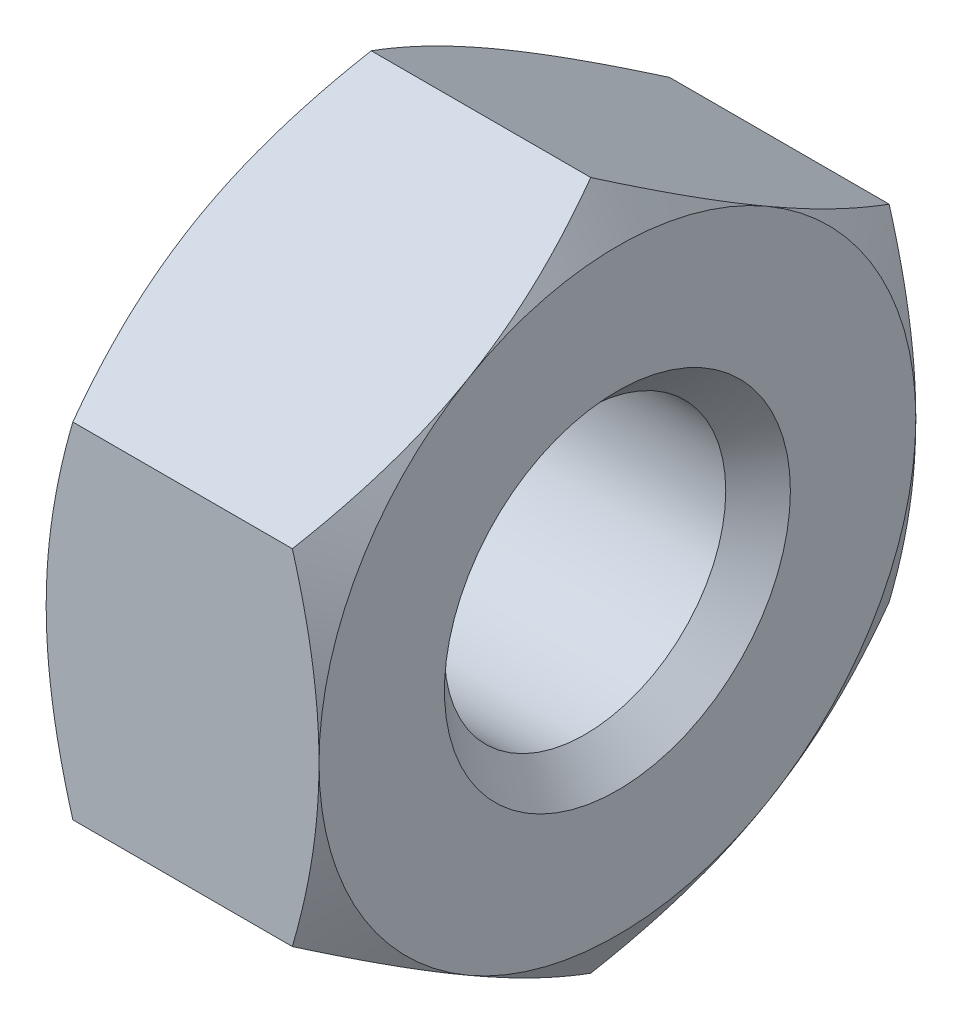
ISO-10303-21;
HEADER;
FILE_DESCRIPTION(('STEP AP214'),'2;1');
FILE_NAME('part.step','',(''),(''),'','','');
FILE_SCHEMA(('AUTOMOTIVE_DESIGN { 1 0 10303 214 1 1 1 1 }'));
ENDSEC;
DATA;
#1=APPLICATION_CONTEXT('core data for automotive mechanical design processes');
#2=APPLICATION_PROTOCOL_DEFINITION('international standard','automotive_design',2000,#1);
#3=PRODUCT_CONTEXT('',#1,'mechanical');
#4=PRODUCT('Part','Part','',(#3));
#5=PRODUCT_RELATED_PRODUCT_CATEGORY('part','',(#4));
#6=PRODUCT_DEFINITION_FORMATION('','',#4);
#7=PRODUCT_DEFINITION_CONTEXT('part definition',#1,'design');
#8=PRODUCT_DEFINITION('design','',#6,#7);
#9=PRODUCT_DEFINITION_SHAPE('','',#8);
#10=(LENGTH_UNIT() NAMED_UNIT(*) SI_UNIT(.MILLI.,.METRE.));
#11=(NAMED_UNIT(*) PLANE_ANGLE_UNIT() SI_UNIT($,.RADIAN.));
#12=(NAMED_UNIT(*) SI_UNIT($,.STERADIAN.) SOLID_ANGLE_UNIT());
#13=UNCERTAINTY_MEASURE_WITH_UNIT(LENGTH_MEASURE(1.E-05),#10,'distance_accuracy_value','');
#14=(GEOMETRIC_REPRESENTATION_CONTEXT(3) GLOBAL_UNCERTAINTY_ASSIGNED_CONTEXT((#13)) GLOBAL_UNIT_ASSIGNED_CONTEXT((#10,
#11,#12)) REPRESENTATION_CONTEXT('',''));
#15=CARTESIAN_POINT('',(0.,0.,0.));
#16=DIRECTION('',(0.,0.,1.));
#17=DIRECTION('',(1.,0.,0.));
#18=AXIS2_PLACEMENT_3D('',#15,#16,#17);
#19=CARTESIAN_POINT('',(1.6,4.04145188432739,0.));
#20=DIRECTION('',(0.,-0.866025403784437,-0.500000000000003));
#21=DIRECTION('',(0.,0.500000000000003,-0.866025403784437));
#22=AXIS2_PLACEMENT_3D('',#19,#20,#21);
#23=PLANE('',#22);
#24=CARTESIAN_POINT('',(1.28732593930663,4.04156735438123,-0.000200000000000052));
#25=CARTESIAN_POINT('',(1.33861421101002,3.95276673849841,0.15360717845245));
#26=CARTESIAN_POINT('',(1.3852590461838,3.86319960126199,0.308742010834423));
#27=CARTESIAN_POINT('',(1.46667812446665,3.68251437287563,0.62169800657678));
#28=CARTESIAN_POINT('',(1.50142356441544,3.59139307116726,0.779524730787495));
#29=CARTESIAN_POINT('',(1.55550997281716,3.41027974688034,1.09322221038013));
#30=CARTESIAN_POINT('',(1.57521091373962,3.32031559103708,1.24904469916069));
#31=CARTESIAN_POINT('',(1.59872986726275,3.13996396008052,1.56142288720537));
#32=CARTESIAN_POINT('',(1.60256735545444,3.04957714051106,1.71797745103423));
#33=CARTESIAN_POINT('',(1.59458469812302,2.88068384499777,2.01050921992099));
#34=CARTESIAN_POINT('',(1.5847245659304,2.80215208834114,2.1465302124579));
#35=CARTESIAN_POINT('',(1.5534735331006,2.64560020969753,2.41768602028899));
#36=CARTESIAN_POINT('',(1.53207195671421,2.56758062920649,2.55281989768468));
#37=CARTESIAN_POINT('',(1.47856959211943,2.41070596159678,2.82453479240518));
#38=CARTESIAN_POINT('',(1.44624200555492,2.33187072981463,2.96108141927834));
#39=CARTESIAN_POINT('',(1.37287106619201,2.17537608630782,3.2321380929445));
#40=CARTESIAN_POINT('',(1.33184495343014,2.09771466960098,3.36665161246854));
#41=CARTESIAN_POINT('',(1.28732593930664,2.02061047210984,3.5002));
#42=B_SPLINE_CURVE_WITH_KNOTS('',3,(#24,#25,#26,#27,#28,#29,#30,#31,#32,#33,#34,#35,#36,#37,#38,
#39,#40,#41),.UNSPECIFIED.,.F.,.F.,(4,2,2,2,2,2,2,2,4),(0.,0.554793832886254,1.11092123814984,
1.65328467083219,2.19498204478403,2.6666513085086,3.13875761298268,3.6213361260051,
4.10296698719188),.UNSPECIFIED.);
#43=CARTESIAN_POINT('',(1.28739260883036,4.04145188432739,0.));
#44=VERTEX_POINT('',#43);
#45=CARTESIAN_POINT('',(1.6,3.03108891324553,1.75000000000001));
#46=VERTEX_POINT('',#45);
#47=EDGE_CURVE('E252',#44,#46,#42,.T.);
#48=ORIENTED_EDGE('',*,*,#47,.F.);
#49=DIRECTION('',(-1.,0.,0.));
#50=VECTOR('',#49,1.);
#51=CARTESIAN_POINT('',(1.6,4.04145188432739,0.));
#52=LINE('',#51,#50);
#53=CARTESIAN_POINT('',(-1.28739260883036,4.04145188432739,0.));
#54=VERTEX_POINT('',#53);
#55=EDGE_CURVE('E337',#44,#54,#52,.T.);
#56=ORIENTED_EDGE('',*,*,#55,.T.);
#57=CARTESIAN_POINT('',(-1.28732593930664,2.02061047210984,3.5002));
#58=CARTESIAN_POINT('',(-1.33861421101002,2.10941108799266,3.34639282154755));
#59=CARTESIAN_POINT('',(-1.38525904618381,2.19897822522908,3.19125798916558));
#60=CARTESIAN_POINT('',(-1.46667812446666,2.37966345361544,2.87830199342322));
#61=CARTESIAN_POINT('',(-1.50142356441544,2.47078475532382,2.72047526921251));
#62=CARTESIAN_POINT('',(-1.55550997281717,2.65189807961073,2.40677778961988));
#63=CARTESIAN_POINT('',(-1.57521091373962,2.74186223545399,2.25095530083932));
#64=CARTESIAN_POINT('',(-1.59872986726275,2.92221386641055,1.93857711279464));
#65=CARTESIAN_POINT('',(-1.60256735545444,3.01260068598001,1.78202254896578));
#66=CARTESIAN_POINT('',(-1.59458469812302,3.1814939814933,1.48949078007902));
#67=CARTESIAN_POINT('',(-1.58472456593039,3.26002573814993,1.3534697875421));
#68=CARTESIAN_POINT('',(-1.5534735331006,3.41657761679354,1.08231397971101));
#69=CARTESIAN_POINT('',(-1.5320719567142,3.49459719728458,0.947180102315323));
#70=CARTESIAN_POINT('',(-1.47856959211942,3.65147186489429,0.67546520759482));
#71=CARTESIAN_POINT('',(-1.44624200555491,3.73030709667644,0.538918580721667));
#72=CARTESIAN_POINT('',(-1.37287106619201,3.88680174018325,0.2678619070555));
#73=CARTESIAN_POINT('',(-1.33184495343013,3.9644631568901,0.133348387531464));
#74=CARTESIAN_POINT('',(-1.28732593930663,4.04156735438123,-0.000200000000000204));
#75=B_SPLINE_CURVE_WITH_KNOTS('',3,(#57,#58,#59,#60,#61,#62,#63,#64,#65,#66,#67,#68,#69,#70,#71,
#72,#73,#74),.UNSPECIFIED.,.F.,.F.,(4,2,2,2,2,2,2,2,4),(0.,0.554793832886252,1.11092123814983,
1.65328467083218,2.19498204478403,2.6666513085086,3.13875761298267,3.6213361260051,
4.10296698719188),.UNSPECIFIED.);
#76=CARTESIAN_POINT('',(-1.6,3.03108891324553,1.75000000000001));
#77=VERTEX_POINT('',#76);
#78=EDGE_CURVE('E223',#77,#54,#75,.T.);
#79=ORIENTED_EDGE('',*,*,#78,.F.);
#80=CARTESIAN_POINT('',(-1.28739260883036,2.02072594216368,3.5));
#81=VERTEX_POINT('',#80);
#82=EDGE_CURVE('E233',#81,#77,#75,.T.);
#83=ORIENTED_EDGE('',*,*,#82,.F.);
#84=DIRECTION('',(-1.,0.,0.));
#85=VECTOR('',#84,1.);
#86=CARTESIAN_POINT('',(1.6,2.02072594216368,3.5));
#87=LINE('',#86,#85);
#88=CARTESIAN_POINT('',(1.28739260883036,2.02072594216368,3.5));
#89=VERTEX_POINT('',#88);
#90=EDGE_CURVE('E261',#89,#81,#87,.T.);
#91=ORIENTED_EDGE('',*,*,#90,.F.);
#92=EDGE_CURVE('E247',#46,#89,#42,.T.);
#93=ORIENTED_EDGE('',*,*,#92,.F.);
#94=EDGE_LOOP('',(#48,#56,#79,#83,#91,#93));
#95=FACE_BOUND('',#94,.T.);
#96=ADVANCED_FACE('F32',(#95),#23,.F.);
#97=CARTESIAN_POINT('',(1.6,2.02072594216368,3.5));
#98=DIRECTION('',(0.,0.,-1.));
#99=DIRECTION('',(-1.,0.,0.));
#100=AXIS2_PLACEMENT_3D('',#97,#98,#99);
#101=PLANE('',#100);
#102=CARTESIAN_POINT('',(-0.1211606899406,-5.45482783436498,3.5));
#103=CARTESIAN_POINT('',(-0.0467894870983474,-5.3017357149315,3.5));
#104=CARTESIAN_POINT('',(0.0268763777665486,-5.14829504766723,3.5));
#105=CARTESIAN_POINT('',(0.172401286461607,-4.84053137398164,3.5));
#106=CARTESIAN_POINT('',(0.244260050794507,-4.68620823554744,3.5));
#107=CARTESIAN_POINT('',(0.386130411045456,-4.37571205777349,3.5));
#108=CARTESIAN_POINT('',(0.456130052143178,-4.21953353739215,3.5));
#109=CARTESIAN_POINT('',(0.593300596594526,-3.90594373758422,3.5));
#110=CARTESIAN_POINT('',(0.660471631779252,-3.7485325160158,3.5));
#111=CARTESIAN_POINT('',(0.79338535374211,-3.42703560011052,3.5));
#112=CARTESIAN_POINT('',(0.859008866627288,-3.26290036915399,3.5));
#113=CARTESIAN_POINT('',(0.98535411062522,-2.93271953642918,3.5));
#114=CARTESIAN_POINT('',(1.04607529534224,-2.76667372406437,3.5));
#115=CARTESIAN_POINT('',(1.16104150532308,-2.43270982344672,3.5));
#116=CARTESIAN_POINT('',(1.21529941292675,-2.26479621443494,3.5));
#117=CARTESIAN_POINT('',(1.31561573151373,-1.92656026567049,3.5));
#118=CARTESIAN_POINT('',(1.3616766968937,-1.75623869422903,3.5));
#119=CARTESIAN_POINT('',(1.44315857859577,-1.41404551048122,3.5));
#120=CARTESIAN_POINT('',(1.47863843502571,-1.24218819417472,3.5));
#121=CARTESIAN_POINT('',(1.53697363303137,-0.896308118991184,3.5));
#122=CARTESIAN_POINT('',(1.55983021212521,-0.722285574092437,3.5));
#123=CARTESIAN_POINT('',(1.59079737212336,-0.375228234412915,3.5));
#124=CARTESIAN_POINT('',(1.59909958781012,-0.202210971256047,3.5));
#125=CARTESIAN_POINT('',(1.60076024307429,0.14391021025075,3.5));
#126=CARTESIAN_POINT('',(1.59411847105241,0.31701412979299,3.5));
#127=CARTESIAN_POINT('',(1.57069415041566,0.610102409348007,3.5));
#128=CARTESIAN_POINT('',(1.5575644295794,0.730397054357784,3.5));
#129=CARTESIAN_POINT('',(1.52489111788916,0.970118040498569,3.5));
#130=CARTESIAN_POINT('',(1.50534667723267,1.08954426443997,3.5));
#131=CARTESIAN_POINT('',(1.43811718090563,1.44635490509246,3.5));
#132=CARTESIAN_POINT('',(1.38184779779745,1.68214058558493,3.5));
#133=CARTESIAN_POINT('',(1.28412072953982,2.03473079428144,3.5));
#134=CARTESIAN_POINT('',(1.2488669153944,2.15335910591269,3.5));
#135=CARTESIAN_POINT('',(1.1746587433176,2.38946373308551,3.5));
#136=CARTESIAN_POINT('',(1.13570436070123,2.50694004093678,3.5));
#137=CARTESIAN_POINT('',(1.05472339086622,2.74077702314843,3.5));
#138=CARTESIAN_POINT('',(1.01269778979002,2.85713804216216,3.5));
#139=CARTESIAN_POINT('',(0.926072663496463,3.0888934981048,3.5));
#140=CARTESIAN_POINT('',(0.881473170161755,3.20428794698629,3.5));
#141=CARTESIAN_POINT('',(0.772347712180041,3.4789692363337,3.5));
#142=CARTESIAN_POINT('',(0.706822483995556,3.63785838347103,3.5));
#143=CARTESIAN_POINT('',(0.572519507264147,3.9542601041324,3.5));
#144=CARTESIAN_POINT('',(0.503741551336008,4.11177258912524,3.5));
#145=CARTESIAN_POINT('',(0.363594353398936,4.42567806353837,3.5));
#146=CARTESIAN_POINT('',(0.29222455680898,4.58207080469237,3.5));
#147=CARTESIAN_POINT('',(0.147414921161031,4.89389648275448,3.5));
#148=CARTESIAN_POINT('',(0.0739750357366672,5.04932939806896,3.5));
#149=CARTESIAN_POINT('',(-0.14899132753005,5.51475169186418,3.5));
#150=CARTESIAN_POINT('',(-0.301018504219181,5.82354226473733,3.5));
#151=CARTESIAN_POINT('',(-0.609560367112607,6.43887251860428,3.5));
#152=CARTESIAN_POINT('',(-0.766075224457644,6.74541211319403,3.5));
#153=CARTESIAN_POINT('',(-1.06875349042837,7.33069352716664,3.5));
#154=CARTESIAN_POINT('',(-1.21465700428667,7.60957000367407,3.5));
#155=CARTESIAN_POINT('',(-1.50845452976277,8.1662840890774,3.5));
#156=CARTESIAN_POINT('',(-1.65634861581493,8.44412165862581,3.5));
#157=CARTESIAN_POINT('',(-1.95326613692092,8.99826755217729,3.5));
#158=CARTESIAN_POINT('',(-2.10228566423136,9.27457797271256,3.5));
#159=CARTESIAN_POINT('',(-2.40151039331863,9.82653580831493,3.5));
#160=CARTESIAN_POINT('',(-2.5517155264679,10.1021832605696,3.5));
#161=CARTESIAN_POINT('',(-2.7023619875745,10.3775875280146,3.5));
#162=B_SPLINE_CURVE_WITH_KNOTS('',3,(#102,#103,#104,#105,#106,#107,#108,#109,#110,#111,#112,
#113,#114,#115,#116,#117,#118,#119,#120,#121,#122,#123,#124,#125,#126,#127,#128,#129,#130,#131,
#132,#133,#134,#135,#136,#137,#138,#139,#140,#141,#142,#143,#144,#145,#146,#147,#148,#149,#150,
#151,#152,#153,#154,#155,#156,#157,#158,#159,#160,#161),.UNSPECIFIED.,.F.,.F.,(4,2,2,2,2,2,2,2,
2,2,2,2,2,2,2,2,2,2,2,2,2,2,2,2,2,2,2,2,2,4),(0.,0.51060816141827,1.02129481687789,
1.53471670867747,2.0481146451947,2.57835720533662,3.10865878303996,3.63788504350141,
4.16694609233999,4.69300256251936,5.21900745179741,5.73803299025936,6.25706587790575,
6.61991748595584,6.98281718289524,7.7090085083048,8.08024398418896,8.45148193660777,
8.82260120698874,9.1937158813221,9.70927686014224,10.2248707535459,10.7405756271972,
11.256292060929,12.2887863072038,13.3213199808538,14.2655229206134,15.2097612660084,
16.1515586981073,17.0933020092743),.UNSPECIFIED.);
#163=CARTESIAN_POINT('',(1.6,0.,3.5));
#164=VERTEX_POINT('',#163);
#165=EDGE_CURVE('E253',#89,#164,#162,.F.);
#166=ORIENTED_EDGE('',*,*,#165,.F.);
#167=ORIENTED_EDGE('',*,*,#90,.T.);
#168=CARTESIAN_POINT('',(0.1211606899406,-5.45482783436498,3.5));
#169=CARTESIAN_POINT('',(0.0467894870983474,-5.3017357149315,3.5));
#170=CARTESIAN_POINT('',(-0.0268763777665486,-5.14829504766723,3.5));
#171=CARTESIAN_POINT('',(-0.172401286461607,-4.84053137398164,3.5));
#172=CARTESIAN_POINT('',(-0.244260050794507,-4.68620823554744,3.5));
#173=CARTESIAN_POINT('',(-0.386130411045456,-4.37571205777349,3.5));
#174=CARTESIAN_POINT('',(-0.456130052143178,-4.21953353739215,3.5));
#175=CARTESIAN_POINT('',(-0.593300596594526,-3.90594373758422,3.5));
#176=CARTESIAN_POINT('',(-0.660471631779252,-3.7485325160158,3.5));
#177=CARTESIAN_POINT('',(-0.79338535374211,-3.42703560011052,3.5));
#178=CARTESIAN_POINT('',(-0.859008866627288,-3.26290036915399,3.5));
#179=CARTESIAN_POINT('',(-0.98535411062522,-2.93271953642918,3.5));
#180=CARTESIAN_POINT('',(-1.04607529534224,-2.76667372406437,3.5));
#181=CARTESIAN_POINT('',(-1.16104150532308,-2.43270982344672,3.5));
#182=CARTESIAN_POINT('',(-1.21529941292675,-2.26479621443494,3.5));
#183=CARTESIAN_POINT('',(-1.31561573151373,-1.92656026567049,3.5));
#184=CARTESIAN_POINT('',(-1.3616766968937,-1.75623869422903,3.5));
#185=CARTESIAN_POINT('',(-1.44315857859577,-1.41404551048122,3.5));
#186=CARTESIAN_POINT('',(-1.47863843502571,-1.24218819417472,3.5));
#187=CARTESIAN_POINT('',(-1.53697363303137,-0.896308118991184,3.5));
#188=CARTESIAN_POINT('',(-1.55983021212521,-0.722285574092437,3.5));
#189=CARTESIAN_POINT('',(-1.59079737212336,-0.375228234412915,3.5));
#190=CARTESIAN_POINT('',(-1.59909958781012,-0.202210971256047,3.5));
#191=CARTESIAN_POINT('',(-1.60076024307429,0.14391021025075,3.5));
#192=CARTESIAN_POINT('',(-1.59411847105241,0.31701412979299,3.5));
#193=CARTESIAN_POINT('',(-1.57069415041566,0.610102409348007,3.5));
#194=CARTESIAN_POINT('',(-1.5575644295794,0.730397054357784,3.5));
#195=CARTESIAN_POINT('',(-1.52489111788916,0.970118040498569,3.5));
#196=CARTESIAN_POINT('',(-1.50534667723267,1.08954426443997,3.5));
#197=CARTESIAN_POINT('',(-1.43811718090563,1.44635490509246,3.5));
#198=CARTESIAN_POINT('',(-1.38184779779745,1.68214058558493,3.5));
#199=CARTESIAN_POINT('',(-1.28412072953982,2.03473079428144,3.5));
#200=CARTESIAN_POINT('',(-1.2488669153944,2.15335910591269,3.5));
#201=CARTESIAN_POINT('',(-1.1746587433176,2.38946373308551,3.5));
#202=CARTESIAN_POINT('',(-1.13570436070123,2.50694004093678,3.5));
#203=CARTESIAN_POINT('',(-1.05472339086622,2.74077702314843,3.5));
#204=CARTESIAN_POINT('',(-1.01269778979002,2.85713804216216,3.5));
#205=CARTESIAN_POINT('',(-0.926072663496463,3.0888934981048,3.5));
#206=CARTESIAN_POINT('',(-0.881473170161755,3.20428794698629,3.5));
#207=CARTESIAN_POINT('',(-0.772347712180041,3.4789692363337,3.5));
#208=CARTESIAN_POINT('',(-0.706822483995556,3.63785838347103,3.5));
#209=CARTESIAN_POINT('',(-0.572519507264147,3.9542601041324,3.5));
#210=CARTESIAN_POINT('',(-0.503741551336008,4.11177258912524,3.5));
#211=CARTESIAN_POINT('',(-0.363594353398936,4.42567806353837,3.5));
#212=CARTESIAN_POINT('',(-0.29222455680898,4.58207080469237,3.5));
#213=CARTESIAN_POINT('',(-0.147414921161031,4.89389648275448,3.5));
#214=CARTESIAN_POINT('',(-0.0739750357366672,5.04932939806896,3.5));
#215=CARTESIAN_POINT('',(0.14899132753005,5.51475169186418,3.5));
#216=CARTESIAN_POINT('',(0.301018504219181,5.82354226473733,3.5));
#217=CARTESIAN_POINT('',(0.609560367112607,6.43887251860428,3.5));
#218=CARTESIAN_POINT('',(0.766075224457644,6.74541211319403,3.5));
#219=CARTESIAN_POINT('',(1.06875349042837,7.33069352716664,3.5));
#220=CARTESIAN_POINT('',(1.21465700428667,7.60957000367407,3.5));
#221=CARTESIAN_POINT('',(1.50845452976277,8.1662840890774,3.5));
#222=CARTESIAN_POINT('',(1.65634861581493,8.44412165862581,3.5));
#223=CARTESIAN_POINT('',(1.95326613692092,8.99826755217729,3.5));
#224=CARTESIAN_POINT('',(2.10228566423136,9.27457797271256,3.5));
#225=CARTESIAN_POINT('',(2.40151039331863,9.82653580831493,3.5));
#226=CARTESIAN_POINT('',(2.5517155264679,10.1021832605696,3.5));
#227=CARTESIAN_POINT('',(2.7023619875745,10.3775875280146,3.5));
#228=B_SPLINE_CURVE_WITH_KNOTS('',3,(#168,#169,#170,#171,#172,#173,#174,#175,#176,#177,#178,
#179,#180,#181,#182,#183,#184,#185,#186,#187,#188,#189,#190,#191,#192,#193,#194,#195,#196,#197,
#198,#199,#200,#201,#202,#203,#204,#205,#206,#207,#208,#209,#210,#211,#212,#213,#214,#215,#216,
#217,#218,#219,#220,#221,#222,#223,#224,#225,#226,#227),.UNSPECIFIED.,.F.,.F.,(4,2,2,2,2,2,2,2,
2,2,2,2,2,2,2,2,2,2,2,2,2,2,2,2,2,2,2,2,2,4),(0.,0.51060816141827,1.02129481687789,
1.53471670867747,2.0481146451947,2.57835720533662,3.10865878303996,3.63788504350141,
4.16694609233999,4.69300256251936,5.21900745179741,5.73803299025936,6.25706587790575,
6.61991748595584,6.98281718289524,7.7090085083048,8.08024398418896,8.45148193660777,
8.82260120698874,9.1937158813221,9.70927686014224,10.2248707535459,10.7405756271972,
11.256292060929,12.2887863072038,13.3213199808538,14.2655229206134,15.2097612660084,
16.1515586981073,17.0933020092743),.UNSPECIFIED.);
#229=CARTESIAN_POINT('',(-1.6,0.,3.5));
#230=VERTEX_POINT('',#229);
#231=EDGE_CURVE('E315',#230,#81,#228,.T.);
#232=ORIENTED_EDGE('',*,*,#231,.F.);
#233=CARTESIAN_POINT('',(-1.28739260883061,-2.02072594216407,3.5));
#234=VERTEX_POINT('',#233);
#235=EDGE_CURVE('E319',#234,#230,#228,.T.);
#236=ORIENTED_EDGE('',*,*,#235,.F.);
#237=DIRECTION('',(-1.,0.,0.));
#238=VECTOR('',#237,1.);
#239=CARTESIAN_POINT('',(1.6,-2.0207259421637,3.5));
#240=LINE('',#239,#238);
#241=CARTESIAN_POINT('',(1.28739260883036,-2.0207259421637,3.5));
#242=VERTEX_POINT('',#241);
#243=EDGE_CURVE('E268',#242,#234,#240,.T.);
#244=ORIENTED_EDGE('',*,*,#243,.F.);
#245=EDGE_CURVE('E128',#164,#242,#162,.F.);
#246=ORIENTED_EDGE('',*,*,#245,.F.);
#247=EDGE_LOOP('',(#166,#167,#232,#236,#244,#246));
#248=FACE_BOUND('',#247,.T.);
#249=ADVANCED_FACE('F242',(#248),#101,.F.);
#250=CARTESIAN_POINT('',(1.6,-2.0207259421637,3.5));
#251=DIRECTION('',(0.,0.866025403784438,-0.500000000000001));
#252=DIRECTION('',(0.,0.500000000000001,0.866025403784438));
#253=AXIS2_PLACEMENT_3D('',#250,#251,#252);
#254=PLANE('',#253);
#255=CARTESIAN_POINT('',(1.28732593930663,-2.02061047210986,3.5002));
#256=CARTESIAN_POINT('',(1.33861421101002,-2.10941108799268,3.34639282154755));
#257=CARTESIAN_POINT('',(1.3852590461838,-2.1989782252291,3.19125798916558));
#258=CARTESIAN_POINT('',(1.46667812446665,-2.37966345361545,2.87830199342322));
#259=CARTESIAN_POINT('',(1.50142356441544,-2.47078475532383,2.72047526921251));
#260=CARTESIAN_POINT('',(1.55550997281716,-2.65189807961074,2.40677778961988));
#261=CARTESIAN_POINT('',(1.57521091373962,-2.741862235454,2.25095530083931));
#262=CARTESIAN_POINT('',(1.59872986726274,-2.92221386641056,1.93857711279463));
#263=CARTESIAN_POINT('',(1.60256735545443,-3.01260068598002,1.78202254896577));
#264=CARTESIAN_POINT('',(1.59458469812302,-3.1814939814933,1.48949078007901));
#265=CARTESIAN_POINT('',(1.58472456593039,-3.26002573814993,1.3534697875421));
#266=CARTESIAN_POINT('',(1.55347353310059,-3.41657761679354,1.08231397971101));
#267=CARTESIAN_POINT('',(1.5320719567142,-3.49459719728458,0.94718010231532));
#268=CARTESIAN_POINT('',(1.47856959211942,-3.6514718648943,0.675465207594818));
#269=CARTESIAN_POINT('',(1.44624200555491,-3.73030709667644,0.538918580721666));
#270=CARTESIAN_POINT('',(1.37287106619201,-3.88680174018325,0.267861907055499));
#271=CARTESIAN_POINT('',(1.33184495343013,-3.9644631568901,0.133348387531464));
#272=CARTESIAN_POINT('',(1.28732593930663,-4.04156735438123,-0.000199999999999399));
#273=B_SPLINE_CURVE_WITH_KNOTS('',3,(#255,#256,#257,#258,#259,#260,#261,#262,#263,#264,#265,
#266,#267,#268,#269,#270,#271,#272),.UNSPECIFIED.,.F.,.F.,(4,2,2,2,2,2,2,2,4),(0.,
0.554793832886254,1.11092123814984,1.65328467083219,2.19498204478403,2.6666513085086,
3.13875761298267,3.6213361260051,4.10296698719187),.UNSPECIFIED.);
#274=CARTESIAN_POINT('',(1.6,-3.03108891324554,1.75));
#275=VERTEX_POINT('',#274);
#276=EDGE_CURVE('E121',#242,#275,#273,.T.);
#277=ORIENTED_EDGE('',*,*,#276,.F.);
#278=ORIENTED_EDGE('',*,*,#243,.T.);
#279=CARTESIAN_POINT('',(-1.28732593930663,-4.04156735438123,-0.000199999999999895));
#280=CARTESIAN_POINT('',(-1.33861421101002,-3.95276673849841,0.15360717845245));
#281=CARTESIAN_POINT('',(-1.3852590461838,-3.86319960126199,0.308742010834424));
#282=CARTESIAN_POINT('',(-1.46667812446665,-3.68251437287563,0.621698006576782));
#283=CARTESIAN_POINT('',(-1.50142356441544,-3.59139307116726,0.779524730787497));
#284=CARTESIAN_POINT('',(-1.55550997281716,-3.41027974688034,1.09322221038013));
#285=CARTESIAN_POINT('',(-1.57521091373962,-3.32031559103709,1.24904469916069));
#286=CARTESIAN_POINT('',(-1.59872986726274,-3.13996396008052,1.56142288720538));
#287=CARTESIAN_POINT('',(-1.60256735545443,-3.04957714051107,1.71797745103423));
#288=CARTESIAN_POINT('',(-1.59458469812302,-2.88068384499778,2.01050921992099));
#289=CARTESIAN_POINT('',(-1.58472456593039,-2.80215208834115,2.14653021245791));
#290=CARTESIAN_POINT('',(-1.5534735331006,-2.64560020969754,2.417686020289));
#291=CARTESIAN_POINT('',(-1.5320719567142,-2.5675806292065,2.55281989768468));
#292=CARTESIAN_POINT('',(-1.47856959211942,-2.41070596159679,2.82453479240519));
#293=CARTESIAN_POINT('',(-1.44624200555491,-2.33187072981464,2.96108141927834));
#294=CARTESIAN_POINT('',(-1.37287106619201,-2.17537608630783,3.2321380929445));
#295=CARTESIAN_POINT('',(-1.33184495343014,-2.09771466960099,3.36665161246854));
#296=CARTESIAN_POINT('',(-1.28732593930663,-2.02061047210986,3.5002));
#297=B_SPLINE_CURVE_WITH_KNOTS('',3,(#279,#280,#281,#282,#283,#284,#285,#286,#287,#288,#289,
#290,#291,#292,#293,#294,#295,#296),.UNSPECIFIED.,.F.,.F.,(4,2,2,2,2,2,2,2,4),(0.,
0.554793832886254,1.11092123814984,1.65328467083219,2.19498204478403,2.6666513085086,
3.13875761298267,3.6213361260051,4.10296698719187),.UNSPECIFIED.);
#298=CARTESIAN_POINT('',(-1.6,-3.03108891324554,1.75000000000001));
#299=VERTEX_POINT('',#298);
#300=EDGE_CURVE('E323',#299,#234,#297,.T.);
#301=ORIENTED_EDGE('',*,*,#300,.F.);
#302=CARTESIAN_POINT('',(-1.28739260883036,-4.04145188432739,0.));
#303=VERTEX_POINT('',#302);
#304=EDGE_CURVE('E336',#303,#299,#297,.T.);
#305=ORIENTED_EDGE('',*,*,#304,.F.);
#306=DIRECTION('',(-1.,0.,0.));
#307=VECTOR('',#306,1.);
#308=CARTESIAN_POINT('',(1.6,-4.04145188432739,0.));
#309=LINE('',#308,#307);
#310=CARTESIAN_POINT('',(1.28739260883036,-4.04145188432739,0.));
#311=VERTEX_POINT('',#310);
#312=EDGE_CURVE('E152',#311,#303,#309,.T.);
#313=ORIENTED_EDGE('',*,*,#312,.F.);
#314=EDGE_CURVE('E132',#275,#311,#273,.T.);
#315=ORIENTED_EDGE('',*,*,#314,.F.);
#316=EDGE_LOOP('',(#277,#278,#301,#305,#313,#315));
#317=FACE_BOUND('',#316,.T.);
#318=ADVANCED_FACE('F150',(#317),#254,.F.);
#319=CARTESIAN_POINT('',(1.6,-4.04145188432739,0.));
#320=DIRECTION('',(0.,0.866025403784438,0.500000000000001));
#321=DIRECTION('',(0.,-0.500000000000001,0.866025403784438));
#322=AXIS2_PLACEMENT_3D('',#319,#320,#321);
#323=PLANE('',#322);
#324=CARTESIAN_POINT('',(1.28732593930663,-4.04156735438123,0.000200000000000038));
#325=CARTESIAN_POINT('',(1.33861421101002,-3.95276673849841,-0.15360717845245));
#326=CARTESIAN_POINT('',(1.3852590461838,-3.86319960126199,-0.308742010834424));
#327=CARTESIAN_POINT('',(1.46667812446665,-3.68251437287563,-0.621698006576782));
#328=CARTESIAN_POINT('',(1.50142356441544,-3.59139307116726,-0.779524730787497));
#329=CARTESIAN_POINT('',(1.55550997281716,-3.41027974688034,-1.09322221038013));
#330=CARTESIAN_POINT('',(1.57521091373962,-3.32031559103709,-1.24904469916069));
#331=CARTESIAN_POINT('',(1.59872986726274,-3.13996396008052,-1.56142288720538));
#332=CARTESIAN_POINT('',(1.60256735545443,-3.04957714051107,-1.71797745103423));
#333=CARTESIAN_POINT('',(1.59458469812302,-2.88068384499778,-2.01050921992099));
#334=CARTESIAN_POINT('',(1.58472456593039,-2.80215208834115,-2.14653021245791));
#335=CARTESIAN_POINT('',(1.5534735331006,-2.64560020969754,-2.417686020289));
#336=CARTESIAN_POINT('',(1.5320719567142,-2.5675806292065,-2.55281989768469));
#337=CARTESIAN_POINT('',(1.47856959211942,-2.41070596159679,-2.82453479240519));
#338=CARTESIAN_POINT('',(1.44624200555491,-2.33187072981464,-2.96108141927834));
#339=CARTESIAN_POINT('',(1.37287106619201,-2.17537608630783,-3.2321380929445));
#340=CARTESIAN_POINT('',(1.33184495343014,-2.09771466960099,-3.36665161246854));
#341=CARTESIAN_POINT('',(1.28732593930663,-2.02061047210986,-3.5002));
#342=B_SPLINE_CURVE_WITH_KNOTS('',3,(#324,#325,#326,#327,#328,#329,#330,#331,#332,#333,#334,
#335,#336,#337,#338,#339,#340,#341),.UNSPECIFIED.,.F.,.F.,(4,2,2,2,2,2,2,2,4),(0.,
0.554793832886254,1.11092123814984,1.65328467083219,2.19498204478403,2.6666513085086,
3.13875761298268,3.6213361260051,4.10296698719187),.UNSPECIFIED.);
#343=CARTESIAN_POINT('',(1.6,-3.03108891324554,-1.75));
#344=VERTEX_POINT('',#343);
#345=EDGE_CURVE('E139',#311,#344,#342,.T.);
#346=ORIENTED_EDGE('',*,*,#345,.F.);
#347=ORIENTED_EDGE('',*,*,#312,.T.);
#348=CARTESIAN_POINT('',(-1.28732593930663,-2.02061047210986,-3.5002));
#349=CARTESIAN_POINT('',(-1.33861421101002,-2.10941108799268,-3.34639282154755));
#350=CARTESIAN_POINT('',(-1.3852590461838,-2.1989782252291,-3.19125798916558));
#351=CARTESIAN_POINT('',(-1.46667812446665,-2.37966345361545,-2.87830199342322));
#352=CARTESIAN_POINT('',(-1.50142356441544,-2.47078475532383,-2.72047526921251));
#353=CARTESIAN_POINT('',(-1.55550997281716,-2.65189807961074,-2.40677778961988));
#354=CARTESIAN_POINT('',(-1.57521091373962,-2.741862235454,-2.25095530083931));
#355=CARTESIAN_POINT('',(-1.59872986726274,-2.92221386641056,-1.93857711279463));
#356=CARTESIAN_POINT('',(-1.60256735545443,-3.01260068598002,-1.78202254896577));
#357=CARTESIAN_POINT('',(-1.59458469812302,-3.1814939814933,-1.48949078007901));
#358=CARTESIAN_POINT('',(-1.58472456593039,-3.26002573814993,-1.3534697875421));
#359=CARTESIAN_POINT('',(-1.55347353310059,-3.41657761679354,-1.08231397971101));
#360=CARTESIAN_POINT('',(-1.5320719567142,-3.49459719728458,-0.947180102315319));
#361=CARTESIAN_POINT('',(-1.47856959211942,-3.6514718648943,-0.675465207594818));
#362=CARTESIAN_POINT('',(-1.44624200555491,-3.73030709667644,-0.538918580721666));
#363=CARTESIAN_POINT('',(-1.37287106619201,-3.88680174018325,-0.267861907055499));
#364=CARTESIAN_POINT('',(-1.33184495343013,-3.9644631568901,-0.133348387531464));
#365=CARTESIAN_POINT('',(-1.28732593930663,-4.04156735438123,0.000199999999999993));
#366=B_SPLINE_CURVE_WITH_KNOTS('',3,(#348,#349,#350,#351,#352,#353,#354,#355,#356,#357,#358,
#359,#360,#361,#362,#363,#364,#365),.UNSPECIFIED.,.F.,.F.,(4,2,2,2,2,2,2,2,4),(0.,
0.554793832886253,1.11092123814984,1.65328467083219,2.19498204478403,2.6666513085086,
3.13875761298267,3.6213361260051,4.10296698719187),.UNSPECIFIED.);
#367=CARTESIAN_POINT('',(-1.6,-3.03108891324554,-1.75000000000001));
#368=VERTEX_POINT('',#367);
#369=EDGE_CURVE('E324',#368,#303,#366,.T.);
#370=ORIENTED_EDGE('',*,*,#369,.F.);
#371=CARTESIAN_POINT('',(-1.28739260883061,-2.02072594216407,-3.5));
#372=VERTEX_POINT('',#371);
#373=EDGE_CURVE('E234',#372,#368,#366,.T.);
#374=ORIENTED_EDGE('',*,*,#373,.F.);
#375=DIRECTION('',(-1.,0.,0.));
#376=VECTOR('',#375,1.);
#377=CARTESIAN_POINT('',(1.6,-2.0207259421637,-3.5));
#378=LINE('',#377,#376);
#379=CARTESIAN_POINT('',(1.28739260883061,-2.02072594216407,-3.5));
#380=VERTEX_POINT('',#379);
#381=EDGE_CURVE('E341',#380,#372,#378,.T.);
#382=ORIENTED_EDGE('',*,*,#381,.F.);
#383=EDGE_CURVE('E153',#344,#380,#342,.T.);
#384=ORIENTED_EDGE('',*,*,#383,.F.);
#385=EDGE_LOOP('',(#346,#347,#370,#374,#382,#384));
#386=FACE_BOUND('',#385,.T.);
#387=ADVANCED_FACE('F208',(#386),#323,.F.);
#388=CARTESIAN_POINT('',(1.6,2.02072594216368,-3.5));
#389=DIRECTION('',(0.,0.,1.));
#390=DIRECTION('',(1.,0.,0.));
#391=AXIS2_PLACEMENT_3D('',#388,#389,#390);
#392=PLANE('',#391);
#393=CARTESIAN_POINT('',(-0.1211606899406,-5.45482783436498,-3.5));
#394=CARTESIAN_POINT('',(-0.0467894870983474,-5.3017357149315,-3.5));
#395=CARTESIAN_POINT('',(0.0268763777665486,-5.14829504766723,-3.5));
#396=CARTESIAN_POINT('',(0.172401286461607,-4.84053137398164,-3.5));
#397=CARTESIAN_POINT('',(0.244260050794507,-4.68620823554744,-3.5));
#398=CARTESIAN_POINT('',(0.386130411045456,-4.37571205777349,-3.5));
#399=CARTESIAN_POINT('',(0.456130052143178,-4.21953353739215,-3.5));
#400=CARTESIAN_POINT('',(0.593300596594526,-3.90594373758422,-3.5));
#401=CARTESIAN_POINT('',(0.660471631779252,-3.7485325160158,-3.5));
#402=CARTESIAN_POINT('',(0.79338535374211,-3.42703560011052,-3.5));
#403=CARTESIAN_POINT('',(0.859008866627288,-3.26290036915399,-3.5));
#404=CARTESIAN_POINT('',(0.98535411062522,-2.93271953642918,-3.5));
#405=CARTESIAN_POINT('',(1.04607529534224,-2.76667372406437,-3.5));
#406=CARTESIAN_POINT('',(1.16104150532308,-2.43270982344672,-3.5));
#407=CARTESIAN_POINT('',(1.21529941292675,-2.26479621443494,-3.5));
#408=CARTESIAN_POINT('',(1.31561573151373,-1.92656026567049,-3.5));
#409=CARTESIAN_POINT('',(1.3616766968937,-1.75623869422903,-3.5));
#410=CARTESIAN_POINT('',(1.44315857859577,-1.41404551048122,-3.5));
#411=CARTESIAN_POINT('',(1.47863843502571,-1.24218819417472,-3.5));
#412=CARTESIAN_POINT('',(1.53697363303137,-0.896308118991184,-3.5));
#413=CARTESIAN_POINT('',(1.55983021212521,-0.722285574092437,-3.5));
#414=CARTESIAN_POINT('',(1.59079737212336,-0.375228234412915,-3.5));
#415=CARTESIAN_POINT('',(1.59909958781012,-0.202210971256047,-3.5));
#416=CARTESIAN_POINT('',(1.60076024307429,0.14391021025075,-3.5));
#417=CARTESIAN_POINT('',(1.59411847105241,0.31701412979299,-3.5));
#418=CARTESIAN_POINT('',(1.57069415041566,0.610102409348007,-3.5));
#419=CARTESIAN_POINT('',(1.5575644295794,0.730397054357784,-3.5));
#420=CARTESIAN_POINT('',(1.52489111788916,0.970118040498569,-3.5));
#421=CARTESIAN_POINT('',(1.50534667723267,1.08954426443997,-3.5));
#422=CARTESIAN_POINT('',(1.43811718090563,1.44635490509246,-3.5));
#423=CARTESIAN_POINT('',(1.38184779779745,1.68214058558493,-3.5));
#424=CARTESIAN_POINT('',(1.28412072953982,2.03473079428144,-3.5));
#425=CARTESIAN_POINT('',(1.2488669153944,2.15335910591269,-3.5));
#426=CARTESIAN_POINT('',(1.1746587433176,2.38946373308551,-3.5));
#427=CARTESIAN_POINT('',(1.13570436070123,2.50694004093678,-3.5));
#428=CARTESIAN_POINT('',(1.05472339086622,2.74077702314843,-3.5));
#429=CARTESIAN_POINT('',(1.01269778979002,2.85713804216216,-3.5));
#430=CARTESIAN_POINT('',(0.926072663496463,3.0888934981048,-3.5));
#431=CARTESIAN_POINT('',(0.881473170161755,3.20428794698629,-3.5));
#432=CARTESIAN_POINT('',(0.772347712180041,3.4789692363337,-3.5));
#433=CARTESIAN_POINT('',(0.706822483995556,3.63785838347103,-3.5));
#434=CARTESIAN_POINT('',(0.572519507264147,3.9542601041324,-3.5));
#435=CARTESIAN_POINT('',(0.503741551336008,4.11177258912524,-3.5));
#436=CARTESIAN_POINT('',(0.363594353398936,4.42567806353837,-3.5));
#437=CARTESIAN_POINT('',(0.29222455680898,4.58207080469237,-3.5));
#438=CARTESIAN_POINT('',(0.147414921161031,4.89389648275448,-3.5));
#439=CARTESIAN_POINT('',(0.0739750357366672,5.04932939806896,-3.5));
#440=CARTESIAN_POINT('',(-0.14899132753005,5.51475169186418,-3.5));
#441=CARTESIAN_POINT('',(-0.301018504219181,5.82354226473733,-3.5));
#442=CARTESIAN_POINT('',(-0.609560367112607,6.43887251860428,-3.5));
#443=CARTESIAN_POINT('',(-0.766075224457644,6.74541211319403,-3.5));
#444=CARTESIAN_POINT('',(-1.06875349042837,7.33069352716664,-3.5));
#445=CARTESIAN_POINT('',(-1.21465700428667,7.60957000367407,-3.5));
#446=CARTESIAN_POINT('',(-1.50845452976277,8.1662840890774,-3.5));
#447=CARTESIAN_POINT('',(-1.65634861581493,8.44412165862581,-3.5));
#448=CARTESIAN_POINT('',(-1.95326613692092,8.99826755217729,-3.5));
#449=CARTESIAN_POINT('',(-2.10228566423136,9.27457797271256,-3.5));
#450=CARTESIAN_POINT('',(-2.40151039331863,9.82653580831493,-3.5));
#451=CARTESIAN_POINT('',(-2.5517155264679,10.1021832605696,-3.5));
#452=CARTESIAN_POINT('',(-2.7023619875745,10.3775875280146,-3.5));
#453=B_SPLINE_CURVE_WITH_KNOTS('',3,(#393,#394,#395,#396,#397,#398,#399,#400,#401,#402,#403,
#404,#405,#406,#407,#408,#409,#410,#411,#412,#413,#414,#415,#416,#417,#418,#419,#420,#421,#422,
#423,#424,#425,#426,#427,#428,#429,#430,#431,#432,#433,#434,#435,#436,#437,#438,#439,#440,#441,
#442,#443,#444,#445,#446,#447,#448,#449,#450,#451,#452),.UNSPECIFIED.,.F.,.F.,(4,2,2,2,2,2,2,2,
2,2,2,2,2,2,2,2,2,2,2,2,2,2,2,2,2,2,2,2,2,4),(0.,0.51060816141827,1.02129481687789,
1.53471670867747,2.0481146451947,2.57835720533662,3.10865878303996,3.63788504350141,
4.16694609233999,4.69300256251936,5.21900745179741,5.73803299025936,6.25706587790575,
6.61991748595584,6.98281718289524,7.7090085083048,8.08024398418896,8.45148193660777,
8.82260120698874,9.1937158813221,9.70927686014224,10.2248707535459,10.7405756271972,
11.256292060929,12.2887863072038,13.3213199808538,14.2655229206134,15.2097612660084,
16.1515586981073,17.0933020092743),.UNSPECIFIED.);
#454=CARTESIAN_POINT('',(1.6,0.,-3.5));
#455=VERTEX_POINT('',#454);
#456=EDGE_CURVE('E202',#380,#455,#453,.T.);
#457=ORIENTED_EDGE('',*,*,#456,.F.);
#458=ORIENTED_EDGE('',*,*,#381,.T.);
#459=CARTESIAN_POINT('',(0.1211606899406,-5.45482783436498,-3.5));
#460=CARTESIAN_POINT('',(0.0467894870983474,-5.3017357149315,-3.5));
#461=CARTESIAN_POINT('',(-0.0268763777665486,-5.14829504766723,-3.5));
#462=CARTESIAN_POINT('',(-0.172401286461607,-4.84053137398164,-3.5));
#463=CARTESIAN_POINT('',(-0.244260050794507,-4.68620823554744,-3.5));
#464=CARTESIAN_POINT('',(-0.386130411045456,-4.37571205777349,-3.5));
#465=CARTESIAN_POINT('',(-0.456130052143178,-4.21953353739215,-3.5));
#466=CARTESIAN_POINT('',(-0.593300596594526,-3.90594373758422,-3.5));
#467=CARTESIAN_POINT('',(-0.660471631779252,-3.7485325160158,-3.5));
#468=CARTESIAN_POINT('',(-0.79338535374211,-3.42703560011052,-3.5));
#469=CARTESIAN_POINT('',(-0.859008866627288,-3.26290036915399,-3.5));
#470=CARTESIAN_POINT('',(-0.98535411062522,-2.93271953642918,-3.5));
#471=CARTESIAN_POINT('',(-1.04607529534224,-2.76667372406437,-3.5));
#472=CARTESIAN_POINT('',(-1.16104150532308,-2.43270982344672,-3.5));
#473=CARTESIAN_POINT('',(-1.21529941292675,-2.26479621443494,-3.5));
#474=CARTESIAN_POINT('',(-1.31561573151373,-1.92656026567049,-3.5));
#475=CARTESIAN_POINT('',(-1.3616766968937,-1.75623869422903,-3.5));
#476=CARTESIAN_POINT('',(-1.44315857859577,-1.41404551048122,-3.5));
#477=CARTESIAN_POINT('',(-1.47863843502571,-1.24218819417472,-3.5));
#478=CARTESIAN_POINT('',(-1.53697363303137,-0.896308118991184,-3.5));
#479=CARTESIAN_POINT('',(-1.55983021212521,-0.722285574092437,-3.5));
#480=CARTESIAN_POINT('',(-1.59079737212336,-0.375228234412915,-3.5));
#481=CARTESIAN_POINT('',(-1.59909958781012,-0.202210971256047,-3.5));
#482=CARTESIAN_POINT('',(-1.60076024307429,0.14391021025075,-3.5));
#483=CARTESIAN_POINT('',(-1.59411847105241,0.31701412979299,-3.5));
#484=CARTESIAN_POINT('',(-1.57069415041566,0.610102409348007,-3.5));
#485=CARTESIAN_POINT('',(-1.5575644295794,0.730397054357784,-3.5));
#486=CARTESIAN_POINT('',(-1.52489111788916,0.970118040498569,-3.5));
#487=CARTESIAN_POINT('',(-1.50534667723267,1.08954426443997,-3.5));
#488=CARTESIAN_POINT('',(-1.43811718090563,1.44635490509246,-3.5));
#489=CARTESIAN_POINT('',(-1.38184779779745,1.68214058558493,-3.5));
#490=CARTESIAN_POINT('',(-1.28412072953982,2.03473079428144,-3.5));
#491=CARTESIAN_POINT('',(-1.2488669153944,2.15335910591269,-3.5));
#492=CARTESIAN_POINT('',(-1.1746587433176,2.38946373308551,-3.5));
#493=CARTESIAN_POINT('',(-1.13570436070123,2.50694004093678,-3.5));
#494=CARTESIAN_POINT('',(-1.05472339086622,2.74077702314843,-3.5));
#495=CARTESIAN_POINT('',(-1.01269778979002,2.85713804216216,-3.5));
#496=CARTESIAN_POINT('',(-0.926072663496463,3.0888934981048,-3.5));
#497=CARTESIAN_POINT('',(-0.881473170161755,3.20428794698629,-3.5));
#498=CARTESIAN_POINT('',(-0.772347712180041,3.4789692363337,-3.5));
#499=CARTESIAN_POINT('',(-0.706822483995556,3.63785838347103,-3.5));
#500=CARTESIAN_POINT('',(-0.572519507264147,3.9542601041324,-3.5));
#501=CARTESIAN_POINT('',(-0.503741551336008,4.11177258912524,-3.5));
#502=CARTESIAN_POINT('',(-0.363594353398936,4.42567806353837,-3.5));
#503=CARTESIAN_POINT('',(-0.29222455680898,4.58207080469237,-3.5));
#504=CARTESIAN_POINT('',(-0.147414921161031,4.89389648275448,-3.5));
#505=CARTESIAN_POINT('',(-0.0739750357366672,5.04932939806896,-3.5));
#506=CARTESIAN_POINT('',(0.14899132753005,5.51475169186418,-3.5));
#507=CARTESIAN_POINT('',(0.301018504219181,5.82354226473733,-3.5));
#508=CARTESIAN_POINT('',(0.609560367112607,6.43887251860428,-3.5));
#509=CARTESIAN_POINT('',(0.766075224457644,6.74541211319403,-3.5));
#510=CARTESIAN_POINT('',(1.06875349042837,7.33069352716664,-3.5));
#511=CARTESIAN_POINT('',(1.21465700428667,7.60957000367407,-3.5));
#512=CARTESIAN_POINT('',(1.50845452976277,8.1662840890774,-3.5));
#513=CARTESIAN_POINT('',(1.65634861581493,8.44412165862581,-3.5));
#514=CARTESIAN_POINT('',(1.95326613692092,8.99826755217729,-3.5));
#515=CARTESIAN_POINT('',(2.10228566423136,9.27457797271256,-3.5));
#516=CARTESIAN_POINT('',(2.40151039331863,9.82653580831493,-3.5));
#517=CARTESIAN_POINT('',(2.5517155264679,10.1021832605696,-3.5));
#518=CARTESIAN_POINT('',(2.7023619875745,10.3775875280146,-3.5));
#519=B_SPLINE_CURVE_WITH_KNOTS('',3,(#459,#460,#461,#462,#463,#464,#465,#466,#467,#468,#469,
#470,#471,#472,#473,#474,#475,#476,#477,#478,#479,#480,#481,#482,#483,#484,#485,#486,#487,#488,
#489,#490,#491,#492,#493,#494,#495,#496,#497,#498,#499,#500,#501,#502,#503,#504,#505,#506,#507,
#508,#509,#510,#511,#512,#513,#514,#515,#516,#517,#518),.UNSPECIFIED.,.F.,.F.,(4,2,2,2,2,2,2,2,
2,2,2,2,2,2,2,2,2,2,2,2,2,2,2,2,2,2,2,2,2,4),(0.,0.51060816141827,1.02129481687789,
1.53471670867747,2.0481146451947,2.57835720533662,3.10865878303996,3.63788504350141,
4.16694609233999,4.69300256251936,5.21900745179741,5.73803299025936,6.25706587790575,
6.61991748595584,6.98281718289524,7.7090085083048,8.08024398418896,8.45148193660777,
8.82260120698874,9.1937158813221,9.70927686014224,10.2248707535459,10.7405756271972,
11.256292060929,12.2887863072038,13.3213199808538,14.2655229206134,15.2097612660084,
16.1515586981073,17.0933020092743),.UNSPECIFIED.);
#520=CARTESIAN_POINT('',(-1.6,0.,-3.5));
#521=VERTEX_POINT('',#520);
#522=EDGE_CURVE('E225',#521,#372,#519,.F.);
#523=ORIENTED_EDGE('',*,*,#522,.F.);
#524=CARTESIAN_POINT('',(-1.28739260883036,2.02072594216368,-3.5));
#525=VERTEX_POINT('',#524);
#526=EDGE_CURVE('E215',#525,#521,#519,.F.);
#527=ORIENTED_EDGE('',*,*,#526,.F.);
#528=DIRECTION('',(-1.,0.,0.));
#529=VECTOR('',#528,1.);
#530=CARTESIAN_POINT('',(1.6,2.02072594216368,-3.5));
#531=LINE('',#530,#529);
#532=CARTESIAN_POINT('',(1.28739260883036,2.02072594216368,-3.5));
#533=VERTEX_POINT('',#532);
#534=EDGE_CURVE('E339',#533,#525,#531,.T.);
#535=ORIENTED_EDGE('',*,*,#534,.F.);
#536=EDGE_CURVE('E195',#455,#533,#453,.T.);
#537=ORIENTED_EDGE('',*,*,#536,.F.);
#538=EDGE_LOOP('',(#457,#458,#523,#527,#535,#537));
#539=FACE_BOUND('',#538,.T.);
#540=ADVANCED_FACE('F204',(#539),#392,.F.);
#541=CARTESIAN_POINT('',(1.6,2.02072594216368,-3.5));
#542=DIRECTION('',(0.,-0.866025403784437,0.500000000000003));
#543=DIRECTION('',(0.,-0.500000000000003,-0.866025403784437));
#544=AXIS2_PLACEMENT_3D('',#541,#542,#543);
#545=PLANE('',#544);
#546=CARTESIAN_POINT('',(1.28732593930664,2.02061047210984,-3.5002));
#547=CARTESIAN_POINT('',(1.33861421101002,2.10941108799266,-3.34639282154755));
#548=CARTESIAN_POINT('',(1.38525904618381,2.19897822522908,-3.19125798916558));
#549=CARTESIAN_POINT('',(1.46667812446666,2.37966345361544,-2.87830199342322));
#550=CARTESIAN_POINT('',(1.50142356441544,2.47078475532382,-2.72047526921251));
#551=CARTESIAN_POINT('',(1.55550997281717,2.65189807961073,-2.40677778961988));
#552=CARTESIAN_POINT('',(1.57521091373962,2.74186223545399,-2.25095530083932));
#553=CARTESIAN_POINT('',(1.59872986726275,2.92221386641055,-1.93857711279463));
#554=CARTESIAN_POINT('',(1.60256735545444,3.01260068598001,-1.78202254896578));
#555=CARTESIAN_POINT('',(1.59458469812302,3.1814939814933,-1.48949078007902));
#556=CARTESIAN_POINT('',(1.58472456593039,3.26002573814993,-1.3534697875421));
#557=CARTESIAN_POINT('',(1.5534735331006,3.41657761679354,-1.08231397971101));
#558=CARTESIAN_POINT('',(1.5320719567142,3.49459719728458,-0.947180102315323));
#559=CARTESIAN_POINT('',(1.47856959211942,3.65147186489429,-0.675465207594821));
#560=CARTESIAN_POINT('',(1.44624200555491,3.73030709667644,-0.538918580721668));
#561=CARTESIAN_POINT('',(1.37287106619201,3.88680174018325,-0.267861907055501));
#562=CARTESIAN_POINT('',(1.33184495343013,3.9644631568901,-0.133348387531465));
#563=CARTESIAN_POINT('',(1.28732593930663,4.04156735438123,0.000199999999999444));
#564=B_SPLINE_CURVE_WITH_KNOTS('',3,(#546,#547,#548,#549,#550,#551,#552,#553,#554,#555,#556,
#557,#558,#559,#560,#561,#562,#563),.UNSPECIFIED.,.F.,.F.,(4,2,2,2,2,2,2,2,4),(0.,
0.554793832886253,1.11092123814983,1.65328467083218,2.19498204478403,2.6666513085086,
3.13875761298268,3.6213361260051,4.10296698719188),.UNSPECIFIED.);
#565=CARTESIAN_POINT('',(1.6,3.03108891324553,-1.75000000000001));
#566=VERTEX_POINT('',#565);
#567=EDGE_CURVE('E203',#533,#566,#564,.T.);
#568=ORIENTED_EDGE('',*,*,#567,.F.);
#569=ORIENTED_EDGE('',*,*,#534,.T.);
#570=CARTESIAN_POINT('',(-1.28732593930663,4.04156735438123,0.000199999999999895));
#571=CARTESIAN_POINT('',(-1.33861421101002,3.95276673849841,-0.15360717845245));
#572=CARTESIAN_POINT('',(-1.3852590461838,3.86319960126199,-0.308742010834424));
#573=CARTESIAN_POINT('',(-1.46667812446665,3.68251437287563,-0.621698006576781));
#574=CARTESIAN_POINT('',(-1.50142356441544,3.59139307116726,-0.779524730787495));
#575=CARTESIAN_POINT('',(-1.55550997281716,3.41027974688034,-1.09322221038013));
#576=CARTESIAN_POINT('',(-1.57521091373962,3.32031559103708,-1.24904469916069));
#577=CARTESIAN_POINT('',(-1.59872986726275,3.13996396008052,-1.56142288720537));
#578=CARTESIAN_POINT('',(-1.60256735545444,3.04957714051106,-1.71797745103423));
#579=CARTESIAN_POINT('',(-1.59458469812302,2.88068384499777,-2.01050921992099));
#580=CARTESIAN_POINT('',(-1.5847245659304,2.80215208834114,-2.1465302124579));
#581=CARTESIAN_POINT('',(-1.5534735331006,2.64560020969753,-2.41768602028899));
#582=CARTESIAN_POINT('',(-1.53207195671421,2.56758062920649,-2.55281989768468));
#583=CARTESIAN_POINT('',(-1.47856959211943,2.41070596159678,-2.82453479240518));
#584=CARTESIAN_POINT('',(-1.44624200555492,2.33187072981463,-2.96108141927834));
#585=CARTESIAN_POINT('',(-1.37287106619201,2.17537608630782,-3.2321380929445));
#586=CARTESIAN_POINT('',(-1.33184495343014,2.09771466960097,-3.36665161246854));
#587=CARTESIAN_POINT('',(-1.28732593930664,2.02061047210984,-3.5002));
#588=B_SPLINE_CURVE_WITH_KNOTS('',3,(#570,#571,#572,#573,#574,#575,#576,#577,#578,#579,#580,
#581,#582,#583,#584,#585,#586,#587),.UNSPECIFIED.,.F.,.F.,(4,2,2,2,2,2,2,2,4),(0.,
0.554793832886254,1.11092123814984,1.65328467083219,2.19498204478403,2.6666513085086,
3.13875761298268,3.6213361260051,4.10296698719188),.UNSPECIFIED.);
#589=CARTESIAN_POINT('',(-1.6,3.03108891324553,-1.75000000000001));
#590=VERTEX_POINT('',#589);
#591=EDGE_CURVE('E267',#590,#525,#588,.T.);
#592=ORIENTED_EDGE('',*,*,#591,.F.);
#593=EDGE_CURVE('E271',#54,#590,#588,.T.);
#594=ORIENTED_EDGE('',*,*,#593,.F.);
#595=ORIENTED_EDGE('',*,*,#55,.F.);
#596=EDGE_CURVE('E147',#566,#44,#564,.T.);
#597=ORIENTED_EDGE('',*,*,#596,.F.);
#598=EDGE_LOOP('',(#568,#569,#592,#594,#595,#597));
#599=FACE_BOUND('',#598,.T.);
#600=ADVANCED_FACE('F207',(#599),#545,.F.);
#601=CARTESIAN_POINT('',(1.6,0.,0.));
#602=DIRECTION('',(1.,0.,0.));
#603=DIRECTION('',(0.,0.,-1.));
#604=AXIS2_PLACEMENT_3D('',#601,#602,#603);
#605=PLANE('',#604);
#606=CARTESIAN_POINT('',(1.6,0.,0.));
#607=DIRECTION('',(1.,0.,0.));
#608=DIRECTION('',(0.,0.,-1.));
#609=AXIS2_PLACEMENT_3D('',#606,#607,#608);
#610=CIRCLE('',#609,2.02900000000001);
#611=CARTESIAN_POINT('',(1.6,0.,-2.02900000000001));
#612=VERTEX_POINT('',#611);
#613=EDGE_CURVE('E11',#612,#612,#610,.F.);
#614=ORIENTED_EDGE('',*,*,#613,.T.);
#615=EDGE_LOOP('',(#614));
#616=FACE_BOUND('',#615,.T.);
#617=CARTESIAN_POINT('',(1.6,0.,0.));
#618=DIRECTION('',(1.,0.,0.));
#619=DIRECTION('',(0.,0.,-1.));
#620=AXIS2_PLACEMENT_3D('',#617,#618,#619);
#621=CIRCLE('',#620,3.5);
#622=EDGE_CURVE('E143',#344,#455,#621,.T.);
#623=ORIENTED_EDGE('',*,*,#622,.T.);
#624=EDGE_CURVE('E47',#455,#566,#621,.T.);
#625=ORIENTED_EDGE('',*,*,#624,.T.);
#626=EDGE_CURVE('E375',#566,#46,#621,.T.);
#627=ORIENTED_EDGE('',*,*,#626,.T.);
#628=EDGE_CURVE('E142',#46,#164,#621,.T.);
#629=ORIENTED_EDGE('',*,*,#628,.T.);
#630=CARTESIAN_POINT('',(1.6,0.,0.));
#631=DIRECTION('',(-1.,0.,0.));
#632=DIRECTION('',(0.,-1.,0.));
#633=AXIS2_PLACEMENT_3D('',#630,#631,#632);
#634=CIRCLE('',#633,3.5);
#635=EDGE_CURVE('E125',#275,#164,#634,.T.);
#636=ORIENTED_EDGE('',*,*,#635,.F.);
#637=EDGE_CURVE('E136',#275,#344,#621,.T.);
#638=ORIENTED_EDGE('',*,*,#637,.T.);
#639=EDGE_LOOP('',(#623,#625,#627,#629,#636,#638));
#640=FACE_BOUND('',#639,.T.);
#641=ADVANCED_FACE('F145',(#616,#640),#605,.T.);
#642=CARTESIAN_POINT('',(-1.6,0.,0.));
#643=DIRECTION('',(1.,0.,0.));
#644=DIRECTION('',(0.,0.,-1.));
#645=AXIS2_PLACEMENT_3D('',#642,#643,#644);
#646=PLANE('',#645);
#647=CARTESIAN_POINT('',(-1.6,0.,0.));
#648=DIRECTION('',(1.,0.,0.));
#649=DIRECTION('',(0.,0.,-1.));
#650=AXIS2_PLACEMENT_3D('',#647,#648,#649);
#651=CIRCLE('',#650,2.02900000000001);
#652=CARTESIAN_POINT('',(-1.6,0.,-2.02900000000001));
#653=VERTEX_POINT('',#652);
#654=EDGE_CURVE('E280',#653,#653,#651,.T.);
#655=ORIENTED_EDGE('',*,*,#654,.T.);
#656=EDGE_LOOP('',(#655));
#657=FACE_BOUND('',#656,.T.);
#658=CARTESIAN_POINT('',(-1.6,0.,0.));
#659=DIRECTION('',(-1.,0.,0.));
#660=DIRECTION('',(0.,-1.,0.));
#661=AXIS2_PLACEMENT_3D('',#658,#659,#660);
#662=CIRCLE('',#661,3.5);
#663=EDGE_CURVE('E302',#590,#521,#662,.T.);
#664=ORIENTED_EDGE('',*,*,#663,.T.);
#665=EDGE_CURVE('E304',#521,#368,#662,.T.);
#666=ORIENTED_EDGE('',*,*,#665,.T.);
#667=EDGE_CURVE('E257',#368,#299,#662,.T.);
#668=ORIENTED_EDGE('',*,*,#667,.T.);
#669=EDGE_CURVE('E224',#299,#230,#662,.T.);
#670=ORIENTED_EDGE('',*,*,#669,.T.);
#671=EDGE_CURVE('E309',#230,#77,#662,.T.);
#672=ORIENTED_EDGE('',*,*,#671,.T.);
#673=EDGE_CURVE('E306',#77,#590,#662,.T.);
#674=ORIENTED_EDGE('',*,*,#673,.T.);
#675=EDGE_LOOP('',(#664,#666,#668,#670,#672,#674));
#676=FACE_BOUND('',#675,.T.);
#677=ADVANCED_FACE('F295',(#657,#676),#646,.F.);
#678=CARTESIAN_POINT('',(1.6,0.,0.));
#679=DIRECTION('',(-1.,0.,0.));
#680=DIRECTION('',(0.,0.,1.));
#681=AXIS2_PLACEMENT_3D('',#678,#679,#680);
#682=CYLINDRICAL_SURFACE('',#681,1.65000000000001);
#683=CARTESIAN_POINT('',(-1.221,0.,0.));
#684=DIRECTION('',(1.,0.,0.));
#685=DIRECTION('',(0.,0.,-1.));
#686=AXIS2_PLACEMENT_3D('',#683,#684,#685);
#687=CIRCLE('',#686,1.65000000000001);
#688=CARTESIAN_POINT('',(-1.221,0.,-1.65000000000001));
#689=VERTEX_POINT('',#688);
#690=EDGE_CURVE('E40',#689,#689,#687,.F.);
#691=ORIENTED_EDGE('',*,*,#690,.T.);
#692=EDGE_LOOP('',(#691));
#693=FACE_BOUND('',#692,.T.);
#694=CARTESIAN_POINT('',(1.221,0.,0.));
#695=DIRECTION('',(1.,0.,0.));
#696=DIRECTION('',(0.,0.,-1.));
#697=AXIS2_PLACEMENT_3D('',#694,#695,#696);
#698=CIRCLE('',#697,1.65000000000001);
#699=CARTESIAN_POINT('',(1.221,0.,-1.65000000000001));
#700=VERTEX_POINT('',#699);
#701=EDGE_CURVE('E283',#700,#700,#698,.T.);
#702=ORIENTED_EDGE('',*,*,#701,.T.);
#703=EDGE_LOOP('',(#702));
#704=FACE_BOUND('',#703,.T.);
#705=ADVANCED_FACE('F288',(#693,#704),#682,.F.);
#706=CARTESIAN_POINT('',(-1.6,0.,0.));
#707=DIRECTION('',(1.,0.,0.));
#708=DIRECTION('',(0.,1.,0.));
#709=AXIS2_PLACEMENT_3D('',#706,#707,#708);
#710=CONICAL_SURFACE('',#709,3.5,1.0471975511966);
#711=ORIENTED_EDGE('',*,*,#526,.T.);
#712=ORIENTED_EDGE('',*,*,#663,.F.);
#713=ORIENTED_EDGE('',*,*,#591,.T.);
#714=EDGE_LOOP('',(#711,#712,#713));
#715=FACE_BOUND('',#714,.T.);
#716=ADVANCED_FACE('F348',(#715),#710,.T.);
#717=ORIENTED_EDGE('',*,*,#78,.T.);
#718=ORIENTED_EDGE('',*,*,#593,.T.);
#719=ORIENTED_EDGE('',*,*,#673,.F.);
#720=EDGE_LOOP('',(#717,#718,#719));
#721=FACE_BOUND('',#720,.T.);
#722=ADVANCED_FACE('F353',(#721),#710,.T.);
#723=ORIENTED_EDGE('',*,*,#373,.T.);
#724=ORIENTED_EDGE('',*,*,#665,.F.);
#725=ORIENTED_EDGE('',*,*,#522,.T.);
#726=EDGE_LOOP('',(#723,#724,#725));
#727=FACE_BOUND('',#726,.T.);
#728=ADVANCED_FACE('F347',(#727),#710,.T.);
#729=ORIENTED_EDGE('',*,*,#304,.T.);
#730=ORIENTED_EDGE('',*,*,#667,.F.);
#731=ORIENTED_EDGE('',*,*,#369,.T.);
#732=EDGE_LOOP('',(#729,#730,#731));
#733=FACE_BOUND('',#732,.T.);
#734=ADVANCED_FACE('F182',(#733),#710,.T.);
#735=ORIENTED_EDGE('',*,*,#300,.T.);
#736=ORIENTED_EDGE('',*,*,#235,.T.);
#737=ORIENTED_EDGE('',*,*,#669,.F.);
#738=EDGE_LOOP('',(#735,#736,#737));
#739=FACE_BOUND('',#738,.T.);
#740=ADVANCED_FACE('F320',(#739),#710,.T.);
#741=ORIENTED_EDGE('',*,*,#231,.T.);
#742=ORIENTED_EDGE('',*,*,#82,.T.);
#743=ORIENTED_EDGE('',*,*,#671,.F.);
#744=EDGE_LOOP('',(#741,#742,#743));
#745=FACE_BOUND('',#744,.T.);
#746=ADVANCED_FACE('F314',(#745),#710,.T.);
#747=CARTESIAN_POINT('',(1.6,0.,0.));
#748=DIRECTION('',(-1.,0.,0.));
#749=DIRECTION('',(0.,1.,0.));
#750=AXIS2_PLACEMENT_3D('',#747,#748,#749);
#751=CONICAL_SURFACE('',#750,3.5,1.0471975511966);
#752=ORIENTED_EDGE('',*,*,#383,.T.);
#753=ORIENTED_EDGE('',*,*,#456,.T.);
#754=ORIENTED_EDGE('',*,*,#622,.F.);
#755=EDGE_LOOP('',(#752,#753,#754));
#756=FACE_BOUND('',#755,.T.);
#757=ADVANCED_FACE('F369',(#756),#751,.T.);
#758=ORIENTED_EDGE('',*,*,#314,.T.);
#759=ORIENTED_EDGE('',*,*,#345,.T.);
#760=ORIENTED_EDGE('',*,*,#637,.F.);
#761=EDGE_LOOP('',(#758,#759,#760));
#762=FACE_BOUND('',#761,.T.);
#763=ADVANCED_FACE('F137',(#762),#751,.T.);
#764=ORIENTED_EDGE('',*,*,#245,.T.);
#765=ORIENTED_EDGE('',*,*,#276,.T.);
#766=ORIENTED_EDGE('',*,*,#635,.T.);
#767=EDGE_LOOP('',(#764,#765,#766));
#768=FACE_BOUND('',#767,.T.);
#769=ADVANCED_FACE('F123',(#768),#751,.T.);
#770=ORIENTED_EDGE('',*,*,#92,.T.);
#771=ORIENTED_EDGE('',*,*,#165,.T.);
#772=ORIENTED_EDGE('',*,*,#628,.F.);
#773=EDGE_LOOP('',(#770,#771,#772));
#774=FACE_BOUND('',#773,.T.);
#775=ADVANCED_FACE('F180',(#774),#751,.T.);
#776=ORIENTED_EDGE('',*,*,#47,.T.);
#777=ORIENTED_EDGE('',*,*,#626,.F.);
#778=ORIENTED_EDGE('',*,*,#596,.T.);
#779=EDGE_LOOP('',(#776,#777,#778));
#780=FACE_BOUND('',#779,.T.);
#781=ADVANCED_FACE('F175',(#780),#751,.T.);
#782=ORIENTED_EDGE('',*,*,#536,.T.);
#783=ORIENTED_EDGE('',*,*,#567,.T.);
#784=ORIENTED_EDGE('',*,*,#624,.F.);
#785=EDGE_LOOP('',(#782,#783,#784));
#786=FACE_BOUND('',#785,.T.);
#787=ADVANCED_FACE('F179',(#786),#751,.T.);
#788=CARTESIAN_POINT('',(-1.6,0.,0.));
#789=DIRECTION('',(-1.,0.,0.));
#790=DIRECTION('',(0.,0.,1.));
#791=AXIS2_PLACEMENT_3D('',#788,#789,#790);
#792=CONICAL_SURFACE('',#791,2.02900000000001,0.785398163397446);
#793=ORIENTED_EDGE('',*,*,#690,.F.);
#794=EDGE_LOOP('',(#793));
#795=FACE_BOUND('',#794,.T.);
#796=ORIENTED_EDGE('',*,*,#654,.F.);
#797=EDGE_LOOP('',(#796));
#798=FACE_BOUND('',#797,.T.);
#799=ADVANCED_FACE('F245',(#795,#798),#792,.F.);
#800=CARTESIAN_POINT('',(1.221,0.,0.));
#801=DIRECTION('',(1.,0.,0.));
#802=DIRECTION('',(0.,0.,-1.));
#803=AXIS2_PLACEMENT_3D('',#800,#801,#802);
#804=CONICAL_SURFACE('',#803,1.65000000000001,0.785398163397448);
#805=ORIENTED_EDGE('',*,*,#613,.F.);
#806=EDGE_LOOP('',(#805));
#807=FACE_BOUND('',#806,.T.);
#808=ORIENTED_EDGE('',*,*,#701,.F.);
#809=EDGE_LOOP('',(#808));
#810=FACE_BOUND('',#809,.T.);
#811=ADVANCED_FACE('F34',(#807,#810),#804,.F.);
#812=CLOSED_SHELL('',(#96,#249,#318,#387,#540,#600,#641,#677,#705,#716,#722,#728,#734,#740,#746,
#757,#763,#769,#775,#781,#787,#799,#811));
#813=MANIFOLD_SOLID_BREP('B2',#812);
#814=ADVANCED_BREP_SHAPE_REPRESENTATION('',(#18,#813),#14);
#815=SHAPE_DEFINITION_REPRESENTATION(#9,#814);
ENDSEC;
END-ISO-10303-21;
